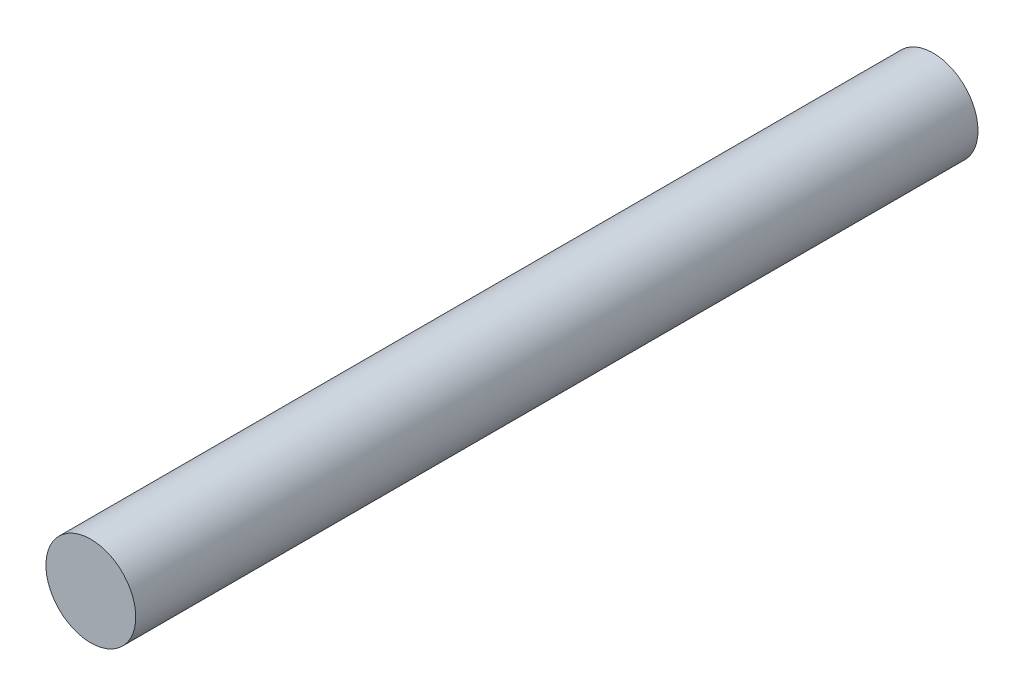
ISO-10303-21;
HEADER;
FILE_DESCRIPTION(('STEP AP214'),'2;1');
FILE_NAME('part.step','',(''),(''),'','','');
FILE_SCHEMA(('AUTOMOTIVE_DESIGN { 1 0 10303 214 1 1 1 1 }'));
ENDSEC;
DATA;
#1=APPLICATION_CONTEXT('core data for automotive mechanical design processes');
#2=APPLICATION_PROTOCOL_DEFINITION('international standard','automotive_design',2000,#1);
#3=PRODUCT_CONTEXT('',#1,'mechanical');
#4=PRODUCT('Part','Part','',(#3));
#5=PRODUCT_RELATED_PRODUCT_CATEGORY('part','',(#4));
#6=PRODUCT_DEFINITION_FORMATION('','',#4);
#7=PRODUCT_DEFINITION_CONTEXT('part definition',#1,'design');
#8=PRODUCT_DEFINITION('design','',#6,#7);
#9=PRODUCT_DEFINITION_SHAPE('','',#8);
#10=(LENGTH_UNIT() NAMED_UNIT(*) SI_UNIT(.MILLI.,.METRE.));
#11=(NAMED_UNIT(*) PLANE_ANGLE_UNIT() SI_UNIT($,.RADIAN.));
#12=(NAMED_UNIT(*) SI_UNIT($,.STERADIAN.) SOLID_ANGLE_UNIT());
#13=UNCERTAINTY_MEASURE_WITH_UNIT(LENGTH_MEASURE(1.E-05),#10,'distance_accuracy_value','');
#14=(GEOMETRIC_REPRESENTATION_CONTEXT(3) GLOBAL_UNCERTAINTY_ASSIGNED_CONTEXT((#13)) GLOBAL_UNIT_ASSIGNED_CONTEXT((#10,
#11,#12)) REPRESENTATION_CONTEXT('',''));
#15=CARTESIAN_POINT('',(0.,0.,0.));
#16=DIRECTION('',(0.,0.,1.));
#17=DIRECTION('',(1.,0.,0.));
#18=AXIS2_PLACEMENT_3D('',#15,#16,#17);
#19=CARTESIAN_POINT('',(36.3758744007896,14.1224289484967,15.));
#20=DIRECTION('',(0.,0.,-1.));
#21=DIRECTION('',(-1.,0.,0.));
#22=AXIS2_PLACEMENT_3D('',#19,#20,#21);
#23=CYLINDRICAL_SURFACE('',#22,0.800000000000002);
#24=CARTESIAN_POINT('',(36.3758744007896,14.1224289484967,15.));
#25=DIRECTION('',(0.,0.,1.));
#26=DIRECTION('',(1.,0.,0.));
#27=AXIS2_PLACEMENT_3D('',#24,#25,#26);
#28=CIRCLE('',#27,0.800000000000002);
#29=CARTESIAN_POINT('',(37.1758744007896,14.1224289484967,15.));
#30=VERTEX_POINT('',#29);
#31=EDGE_CURVE('E10',#30,#30,#28,.T.);
#32=ORIENTED_EDGE('',*,*,#31,.F.);
#33=EDGE_LOOP('',(#32));
#34=FACE_BOUND('',#33,.T.);
#35=CARTESIAN_POINT('',(36.3758744007896,14.1224289484967,0.));
#36=DIRECTION('',(0.,0.,1.));
#37=DIRECTION('',(1.,0.,0.));
#38=AXIS2_PLACEMENT_3D('',#35,#36,#37);
#39=CIRCLE('',#38,0.800000000000002);
#40=CARTESIAN_POINT('',(37.1758744007896,14.1224289484967,0.));
#41=VERTEX_POINT('',#40);
#42=EDGE_CURVE('E35',#41,#41,#39,.T.);
#43=ORIENTED_EDGE('',*,*,#42,.T.);
#44=EDGE_LOOP('',(#43));
#45=FACE_BOUND('',#44,.T.);
#46=ADVANCED_FACE('F32',(#34,#45),#23,.T.);
#47=CARTESIAN_POINT('',(36.3758744007896,14.1224289484967,15.));
#48=DIRECTION('',(0.,0.,1.));
#49=DIRECTION('',(1.,0.,0.));
#50=AXIS2_PLACEMENT_3D('',#47,#48,#49);
#51=PLANE('',#50);
#52=ORIENTED_EDGE('',*,*,#31,.T.);
#53=EDGE_LOOP('',(#52));
#54=FACE_BOUND('',#53,.T.);
#55=ADVANCED_FACE('F47',(#54),#51,.T.);
#56=CARTESIAN_POINT('',(36.3758744007896,14.1224289484967,0.));
#57=DIRECTION('',(0.,0.,1.));
#58=DIRECTION('',(1.,0.,0.));
#59=AXIS2_PLACEMENT_3D('',#56,#57,#58);
#60=PLANE('',#59);
#61=ORIENTED_EDGE('',*,*,#42,.F.);
#62=EDGE_LOOP('',(#61));
#63=FACE_BOUND('',#62,.T.);
#64=ADVANCED_FACE('F45',(#63),#60,.F.);
#65=CLOSED_SHELL('',(#46,#55,#64));
#66=MANIFOLD_SOLID_BREP('B2',#65);
#67=ADVANCED_BREP_SHAPE_REPRESENTATION('',(#18,#66),#14);
#68=SHAPE_DEFINITION_REPRESENTATION(#9,#67);
ENDSEC;
END-ISO-10303-21;
